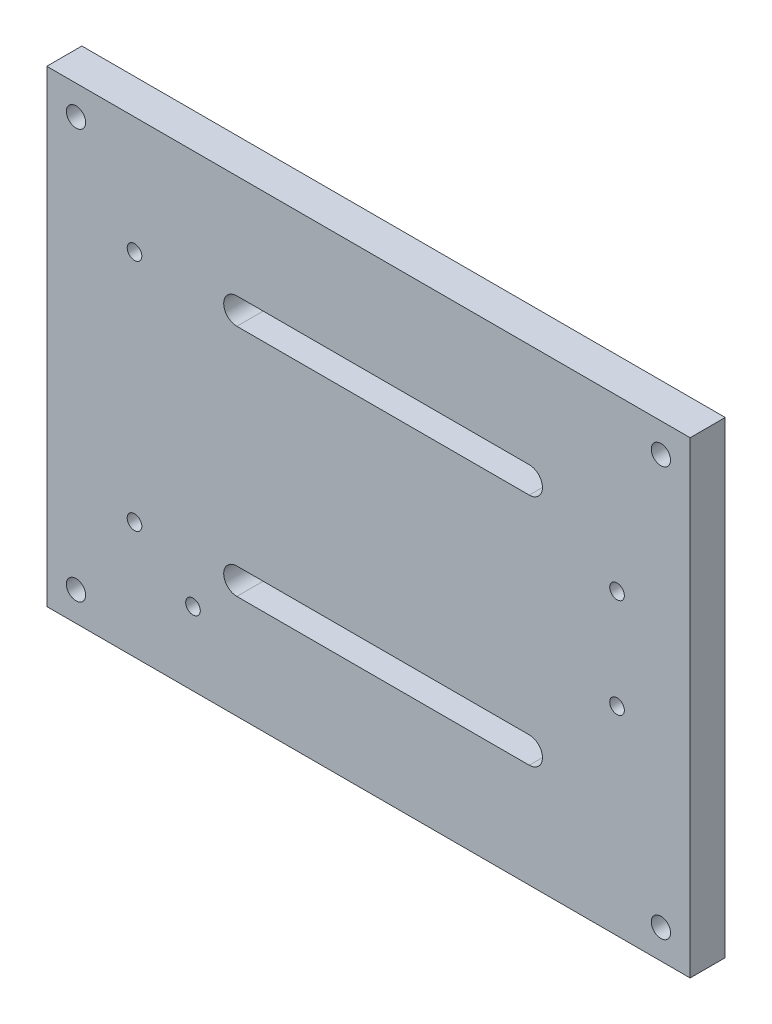
ISO-10303-21;
HEADER;
FILE_DESCRIPTION(('STEP AP214'),'2;1');
FILE_NAME('part.step','',(''),(''),'','','');
FILE_SCHEMA(('AUTOMOTIVE_DESIGN { 1 0 10303 214 1 1 1 1 }'));
ENDSEC;
DATA;
#1=APPLICATION_CONTEXT('core data for automotive mechanical design processes');
#2=APPLICATION_PROTOCOL_DEFINITION('international standard','automotive_design',2000,#1);
#3=PRODUCT_CONTEXT('',#1,'mechanical');
#4=PRODUCT('Part','Part','',(#3));
#5=PRODUCT_RELATED_PRODUCT_CATEGORY('part','',(#4));
#6=PRODUCT_DEFINITION_FORMATION('','',#4);
#7=PRODUCT_DEFINITION_CONTEXT('part definition',#1,'design');
#8=PRODUCT_DEFINITION('design','',#6,#7);
#9=PRODUCT_DEFINITION_SHAPE('','',#8);
#10=(LENGTH_UNIT() NAMED_UNIT(*) SI_UNIT(.MILLI.,.METRE.));
#11=(NAMED_UNIT(*) PLANE_ANGLE_UNIT() SI_UNIT($,.RADIAN.));
#12=(NAMED_UNIT(*) SI_UNIT($,.STERADIAN.) SOLID_ANGLE_UNIT());
#13=UNCERTAINTY_MEASURE_WITH_UNIT(LENGTH_MEASURE(1.E-05),#10,'distance_accuracy_value','');
#14=(GEOMETRIC_REPRESENTATION_CONTEXT(3) GLOBAL_UNCERTAINTY_ASSIGNED_CONTEXT((#13)) GLOBAL_UNIT_ASSIGNED_CONTEXT((#10,
#11,#12)) REPRESENTATION_CONTEXT('',''));
#15=CARTESIAN_POINT('',(0.,0.,0.));
#16=DIRECTION('',(0.,0.,1.));
#17=DIRECTION('',(1.,0.,0.));
#18=AXIS2_PLACEMENT_3D('',#15,#16,#17);
#19=CARTESIAN_POINT('',(0.,0.,12.));
#20=DIRECTION('',(0.,0.,-1.));
#21=DIRECTION('',(-1.,0.,0.));
#22=AXIS2_PLACEMENT_3D('',#19,#20,#21);
#23=PLANE('',#22);
#24=CARTESIAN_POINT('',(30.,120.,12.));
#25=DIRECTION('',(0.,0.,1.));
#26=DIRECTION('',(1.,0.,0.));
#27=AXIS2_PLACEMENT_3D('',#24,#25,#26);
#28=CIRCLE('',#27,2.5);
#29=CARTESIAN_POINT('',(32.5,120.,12.));
#30=VERTEX_POINT('',#29);
#31=EDGE_CURVE('E188',#30,#30,#28,.T.);
#32=ORIENTED_EDGE('',*,*,#31,.F.);
#33=EDGE_LOOP('',(#32));
#34=FACE_BOUND('',#33,.T.);
#35=CARTESIAN_POINT('',(65.,40.,12.));
#36=DIRECTION('',(0.,0.,1.));
#37=DIRECTION('',(-1.,0.,0.));
#38=AXIS2_PLACEMENT_3D('',#35,#36,#37);
#39=CIRCLE('',#38,4.5);
#40=CARTESIAN_POINT('',(65.,44.5,12.));
#41=VERTEX_POINT('',#40);
#42=CARTESIAN_POINT('',(65.,35.5,12.));
#43=VERTEX_POINT('',#42);
#44=EDGE_CURVE('E196',#41,#43,#39,.T.);
#45=ORIENTED_EDGE('',*,*,#44,.F.);
#46=DIRECTION('',(-1.,0.,0.));
#47=VECTOR('',#46,1.);
#48=CARTESIAN_POINT('',(65.,44.5,12.));
#49=LINE('',#48,#47);
#50=CARTESIAN_POINT('',(165.,44.5,12.));
#51=VERTEX_POINT('',#50);
#52=EDGE_CURVE('E207',#51,#41,#49,.T.);
#53=ORIENTED_EDGE('',*,*,#52,.F.);
#54=CARTESIAN_POINT('',(165.,40.,12.));
#55=DIRECTION('',(0.,0.,1.));
#56=DIRECTION('',(-1.,0.,0.));
#57=AXIS2_PLACEMENT_3D('',#54,#55,#56);
#58=CIRCLE('',#57,4.5);
#59=CARTESIAN_POINT('',(165.,35.5,12.));
#60=VERTEX_POINT('',#59);
#61=EDGE_CURVE('E203',#60,#51,#58,.T.);
#62=ORIENTED_EDGE('',*,*,#61,.F.);
#63=DIRECTION('',(1.,0.,0.));
#64=VECTOR('',#63,1.);
#65=CARTESIAN_POINT('',(165.,35.5,12.));
#66=LINE('',#65,#64);
#67=EDGE_CURVE('E199',#43,#60,#66,.T.);
#68=ORIENTED_EDGE('',*,*,#67,.F.);
#69=EDGE_LOOP('',(#45,#53,#62,#68));
#70=FACE_BOUND('',#69,.T.);
#71=DIRECTION('',(0.,-1.,0.));
#72=VECTOR('',#71,1.);
#73=CARTESIAN_POINT('',(0.,0.,12.));
#74=LINE('',#73,#72);
#75=CARTESIAN_POINT('',(0.,160.,12.));
#76=VERTEX_POINT('',#75);
#77=CARTESIAN_POINT('',(0.,0.,12.));
#78=VERTEX_POINT('',#77);
#79=EDGE_CURVE('E278',#76,#78,#74,.T.);
#80=ORIENTED_EDGE('',*,*,#79,.T.);
#81=DIRECTION('',(1.,0.,0.));
#82=VECTOR('',#81,1.);
#83=CARTESIAN_POINT('',(0.,0.,12.));
#84=LINE('',#83,#82);
#85=CARTESIAN_POINT('',(220.,0.,12.));
#86=VERTEX_POINT('',#85);
#87=EDGE_CURVE('E282',#78,#86,#84,.T.);
#88=ORIENTED_EDGE('',*,*,#87,.T.);
#89=DIRECTION('',(0.,1.,0.));
#90=VECTOR('',#89,1.);
#91=CARTESIAN_POINT('',(220.,0.,12.));
#92=LINE('',#91,#90);
#93=CARTESIAN_POINT('',(220.,160.,12.));
#94=VERTEX_POINT('',#93);
#95=EDGE_CURVE('E286',#86,#94,#92,.T.);
#96=ORIENTED_EDGE('',*,*,#95,.T.);
#97=DIRECTION('',(-1.,0.,0.));
#98=VECTOR('',#97,1.);
#99=CARTESIAN_POINT('',(0.,160.,12.));
#100=LINE('',#99,#98);
#101=EDGE_CURVE('E289',#94,#76,#100,.T.);
#102=ORIENTED_EDGE('',*,*,#101,.T.);
#103=EDGE_LOOP('',(#80,#88,#96,#102));
#104=FACE_BOUND('',#103,.T.);
#105=CARTESIAN_POINT('',(10.,10.,12.));
#106=DIRECTION('',(0.,0.,1.));
#107=DIRECTION('',(1.,0.,0.));
#108=AXIS2_PLACEMENT_3D('',#105,#106,#107);
#109=CIRCLE('',#108,3.3);
#110=CARTESIAN_POINT('',(13.3,10.,12.));
#111=VERTEX_POINT('',#110);
#112=EDGE_CURVE('E270',#111,#111,#109,.T.);
#113=ORIENTED_EDGE('',*,*,#112,.F.);
#114=EDGE_LOOP('',(#113));
#115=FACE_BOUND('',#114,.T.);
#116=CARTESIAN_POINT('',(10.,150.,12.));
#117=DIRECTION('',(0.,0.,1.));
#118=DIRECTION('',(1.,0.,0.));
#119=AXIS2_PLACEMENT_3D('',#116,#117,#118);
#120=CIRCLE('',#119,3.3);
#121=CARTESIAN_POINT('',(13.3,150.,12.));
#122=VERTEX_POINT('',#121);
#123=EDGE_CURVE('E263',#122,#122,#120,.T.);
#124=ORIENTED_EDGE('',*,*,#123,.F.);
#125=EDGE_LOOP('',(#124));
#126=FACE_BOUND('',#125,.T.);
#127=CARTESIAN_POINT('',(210.,10.,12.));
#128=DIRECTION('',(0.,0.,1.));
#129=DIRECTION('',(1.,0.,0.));
#130=AXIS2_PLACEMENT_3D('',#127,#128,#129);
#131=CIRCLE('',#130,3.3);
#132=CARTESIAN_POINT('',(213.3,10.,12.));
#133=VERTEX_POINT('',#132);
#134=EDGE_CURVE('E255',#133,#133,#131,.T.);
#135=ORIENTED_EDGE('',*,*,#134,.F.);
#136=EDGE_LOOP('',(#135));
#137=FACE_BOUND('',#136,.T.);
#138=CARTESIAN_POINT('',(210.,150.,12.));
#139=DIRECTION('',(0.,0.,1.));
#140=DIRECTION('',(1.,0.,0.));
#141=AXIS2_PLACEMENT_3D('',#138,#139,#140);
#142=CIRCLE('',#141,3.3);
#143=CARTESIAN_POINT('',(213.3,150.,12.));
#144=VERTEX_POINT('',#143);
#145=EDGE_CURVE('E247',#144,#144,#142,.T.);
#146=ORIENTED_EDGE('',*,*,#145,.F.);
#147=EDGE_LOOP('',(#146));
#148=FACE_BOUND('',#147,.T.);
#149=CARTESIAN_POINT('',(30.,40.,12.));
#150=DIRECTION('',(0.,0.,1.));
#151=DIRECTION('',(1.,0.,0.));
#152=AXIS2_PLACEMENT_3D('',#149,#150,#151);
#153=CIRCLE('',#152,2.5);
#154=CARTESIAN_POINT('',(32.5,40.,12.));
#155=VERTEX_POINT('',#154);
#156=EDGE_CURVE('E239',#155,#155,#153,.T.);
#157=ORIENTED_EDGE('',*,*,#156,.F.);
#158=EDGE_LOOP('',(#157));
#159=FACE_BOUND('',#158,.T.);
#160=CARTESIAN_POINT('',(65.,120.,12.));
#161=DIRECTION('',(0.,0.,1.));
#162=DIRECTION('',(-1.,0.,0.));
#163=AXIS2_PLACEMENT_3D('',#160,#161,#162);
#164=CIRCLE('',#163,4.5);
#165=CARTESIAN_POINT('',(65.,124.5,12.));
#166=VERTEX_POINT('',#165);
#167=CARTESIAN_POINT('',(65.,115.5,12.));
#168=VERTEX_POINT('',#167);
#169=EDGE_CURVE('E135',#166,#168,#164,.T.);
#170=ORIENTED_EDGE('',*,*,#169,.F.);
#171=DIRECTION('',(-1.,0.,0.));
#172=VECTOR('',#171,1.);
#173=CARTESIAN_POINT('',(65.,124.5,12.));
#174=LINE('',#173,#172);
#175=CARTESIAN_POINT('',(165.,124.5,12.));
#176=VERTEX_POINT('',#175);
#177=EDGE_CURVE('E164',#176,#166,#174,.T.);
#178=ORIENTED_EDGE('',*,*,#177,.F.);
#179=CARTESIAN_POINT('',(165.,120.,12.));
#180=DIRECTION('',(0.,0.,1.));
#181=DIRECTION('',(-1.,0.,0.));
#182=AXIS2_PLACEMENT_3D('',#179,#180,#181);
#183=CIRCLE('',#182,4.5);
#184=CARTESIAN_POINT('',(165.,115.5,12.));
#185=VERTEX_POINT('',#184);
#186=EDGE_CURVE('E158',#185,#176,#183,.T.);
#187=ORIENTED_EDGE('',*,*,#186,.F.);
#188=DIRECTION('',(1.,0.,0.));
#189=VECTOR('',#188,1.);
#190=CARTESIAN_POINT('',(165.,115.5,12.));
#191=LINE('',#190,#189);
#192=EDGE_CURVE('E144',#168,#185,#191,.T.);
#193=ORIENTED_EDGE('',*,*,#192,.F.);
#194=EDGE_LOOP('',(#170,#178,#187,#193));
#195=FACE_BOUND('',#194,.T.);
#196=CARTESIAN_POINT('',(50.,25.,12.));
#197=DIRECTION('',(0.,0.,1.));
#198=DIRECTION('',(1.,0.,0.));
#199=AXIS2_PLACEMENT_3D('',#196,#197,#198);
#200=CIRCLE('',#199,2.5);
#201=CARTESIAN_POINT('',(52.5,25.,12.));
#202=VERTEX_POINT('',#201);
#203=EDGE_CURVE('E172',#202,#202,#200,.T.);
#204=ORIENTED_EDGE('',*,*,#203,.F.);
#205=EDGE_LOOP('',(#204));
#206=FACE_BOUND('',#205,.T.);
#207=CARTESIAN_POINT('',(195.,68.,12.));
#208=DIRECTION('',(0.,0.,1.));
#209=DIRECTION('',(1.,0.,0.));
#210=AXIS2_PLACEMENT_3D('',#207,#208,#209);
#211=CIRCLE('',#210,2.5);
#212=CARTESIAN_POINT('',(197.5,68.,12.));
#213=VERTEX_POINT('',#212);
#214=EDGE_CURVE('E386',#213,#213,#211,.T.);
#215=ORIENTED_EDGE('',*,*,#214,.F.);
#216=EDGE_LOOP('',(#215));
#217=FACE_BOUND('',#216,.T.);
#218=CARTESIAN_POINT('',(195.,102.,12.));
#219=DIRECTION('',(0.,0.,1.));
#220=DIRECTION('',(1.,0.,0.));
#221=AXIS2_PLACEMENT_3D('',#218,#219,#220);
#222=CIRCLE('',#221,2.5);
#223=CARTESIAN_POINT('',(197.5,102.,12.));
#224=VERTEX_POINT('',#223);
#225=EDGE_CURVE('E379',#224,#224,#222,.T.);
#226=ORIENTED_EDGE('',*,*,#225,.F.);
#227=EDGE_LOOP('',(#226));
#228=FACE_BOUND('',#227,.T.);
#229=ADVANCED_FACE('F45',(#34,#70,#104,#115,#126,#137,#148,#159,#195,#206,#217,#228),#23,.F.);
#230=CARTESIAN_POINT('',(0.,0.,0.));
#231=DIRECTION('',(0.,0.,-1.));
#232=DIRECTION('',(-1.,0.,0.));
#233=AXIS2_PLACEMENT_3D('',#230,#231,#232);
#234=PLANE('',#233);
#235=CARTESIAN_POINT('',(195.,68.,0.));
#236=DIRECTION('',(0.,0.,1.));
#237=DIRECTION('',(1.,0.,0.));
#238=AXIS2_PLACEMENT_3D('',#235,#236,#237);
#239=CIRCLE('',#238,2.5);
#240=CARTESIAN_POINT('',(197.5,68.,0.));
#241=VERTEX_POINT('',#240);
#242=EDGE_CURVE('E383',#241,#241,#239,.T.);
#243=ORIENTED_EDGE('',*,*,#242,.T.);
#244=EDGE_LOOP('',(#243));
#245=FACE_BOUND('',#244,.T.);
#246=DIRECTION('',(-1.,0.,0.));
#247=VECTOR('',#246,1.);
#248=CARTESIAN_POINT('',(65.,124.5,0.));
#249=LINE('',#248,#247);
#250=CARTESIAN_POINT('',(165.,124.5,0.));
#251=VERTEX_POINT('',#250);
#252=CARTESIAN_POINT('',(65.,124.5,0.));
#253=VERTEX_POINT('',#252);
#254=EDGE_CURVE('E145',#251,#253,#249,.T.);
#255=ORIENTED_EDGE('',*,*,#254,.T.);
#256=CARTESIAN_POINT('',(65.,120.,0.));
#257=DIRECTION('',(0.,0.,1.));
#258=DIRECTION('',(-1.,0.,0.));
#259=AXIS2_PLACEMENT_3D('',#256,#257,#258);
#260=CIRCLE('',#259,4.5);
#261=CARTESIAN_POINT('',(65.,115.5,0.));
#262=VERTEX_POINT('',#261);
#263=EDGE_CURVE('E69',#253,#262,#260,.T.);
#264=ORIENTED_EDGE('',*,*,#263,.T.);
#265=DIRECTION('',(1.,0.,0.));
#266=VECTOR('',#265,1.);
#267=CARTESIAN_POINT('',(165.,115.5,0.));
#268=LINE('',#267,#266);
#269=CARTESIAN_POINT('',(165.,115.5,0.));
#270=VERTEX_POINT('',#269);
#271=EDGE_CURVE('E151',#262,#270,#268,.T.);
#272=ORIENTED_EDGE('',*,*,#271,.T.);
#273=CARTESIAN_POINT('',(165.,120.,0.));
#274=DIRECTION('',(0.,0.,1.));
#275=DIRECTION('',(-1.,0.,0.));
#276=AXIS2_PLACEMENT_3D('',#273,#274,#275);
#277=CIRCLE('',#276,4.5);
#278=EDGE_CURVE('E175',#270,#251,#277,.T.);
#279=ORIENTED_EDGE('',*,*,#278,.T.);
#280=EDGE_LOOP('',(#255,#264,#272,#279));
#281=FACE_BOUND('',#280,.T.);
#282=CARTESIAN_POINT('',(30.,120.,0.));
#283=DIRECTION('',(0.,0.,1.));
#284=DIRECTION('',(1.,0.,0.));
#285=AXIS2_PLACEMENT_3D('',#282,#283,#284);
#286=CIRCLE('',#285,2.5);
#287=CARTESIAN_POINT('',(32.5,120.,0.));
#288=VERTEX_POINT('',#287);
#289=EDGE_CURVE('E153',#288,#288,#286,.T.);
#290=ORIENTED_EDGE('',*,*,#289,.T.);
#291=EDGE_LOOP('',(#290));
#292=FACE_BOUND('',#291,.T.);
#293=CARTESIAN_POINT('',(210.,150.,0.));
#294=DIRECTION('',(0.,0.,1.));
#295=DIRECTION('',(1.,0.,0.));
#296=AXIS2_PLACEMENT_3D('',#293,#294,#295);
#297=CIRCLE('',#296,3.3);
#298=CARTESIAN_POINT('',(213.3,150.,0.));
#299=VERTEX_POINT('',#298);
#300=EDGE_CURVE('E243',#299,#299,#297,.T.);
#301=ORIENTED_EDGE('',*,*,#300,.T.);
#302=EDGE_LOOP('',(#301));
#303=FACE_BOUND('',#302,.T.);
#304=CARTESIAN_POINT('',(10.,150.,0.));
#305=DIRECTION('',(0.,0.,1.));
#306=DIRECTION('',(1.,0.,0.));
#307=AXIS2_PLACEMENT_3D('',#304,#305,#306);
#308=CIRCLE('',#307,3.3);
#309=CARTESIAN_POINT('',(13.3,150.,0.));
#310=VERTEX_POINT('',#309);
#311=EDGE_CURVE('E259',#310,#310,#308,.T.);
#312=ORIENTED_EDGE('',*,*,#311,.T.);
#313=EDGE_LOOP('',(#312));
#314=FACE_BOUND('',#313,.T.);
#315=DIRECTION('',(0.,-1.,0.));
#316=VECTOR('',#315,1.);
#317=CARTESIAN_POINT('',(0.,0.,0.));
#318=LINE('',#317,#316);
#319=CARTESIAN_POINT('',(0.,160.,0.));
#320=VERTEX_POINT('',#319);
#321=CARTESIAN_POINT('',(0.,0.,0.));
#322=VERTEX_POINT('',#321);
#323=EDGE_CURVE('E274',#320,#322,#318,.T.);
#324=ORIENTED_EDGE('',*,*,#323,.F.);
#325=DIRECTION('',(-1.,0.,0.));
#326=VECTOR('',#325,1.);
#327=CARTESIAN_POINT('',(0.,160.,0.));
#328=LINE('',#327,#326);
#329=CARTESIAN_POINT('',(220.,160.,0.));
#330=VERTEX_POINT('',#329);
#331=EDGE_CURVE('E283',#330,#320,#328,.T.);
#332=ORIENTED_EDGE('',*,*,#331,.F.);
#333=DIRECTION('',(0.,1.,0.));
#334=VECTOR('',#333,1.);
#335=CARTESIAN_POINT('',(220.,0.,0.));
#336=LINE('',#335,#334);
#337=CARTESIAN_POINT('',(220.,0.,0.));
#338=VERTEX_POINT('',#337);
#339=EDGE_CURVE('E299',#338,#330,#336,.T.);
#340=ORIENTED_EDGE('',*,*,#339,.F.);
#341=DIRECTION('',(1.,0.,0.));
#342=VECTOR('',#341,1.);
#343=CARTESIAN_POINT('',(0.,0.,0.));
#344=LINE('',#343,#342);
#345=EDGE_CURVE('E296',#322,#338,#344,.T.);
#346=ORIENTED_EDGE('',*,*,#345,.F.);
#347=EDGE_LOOP('',(#324,#332,#340,#346));
#348=FACE_BOUND('',#347,.T.);
#349=CARTESIAN_POINT('',(10.,10.,0.));
#350=DIRECTION('',(0.,0.,1.));
#351=DIRECTION('',(1.,0.,0.));
#352=AXIS2_PLACEMENT_3D('',#349,#350,#351);
#353=CIRCLE('',#352,3.3);
#354=CARTESIAN_POINT('',(13.3,10.,0.));
#355=VERTEX_POINT('',#354);
#356=EDGE_CURVE('E267',#355,#355,#353,.T.);
#357=ORIENTED_EDGE('',*,*,#356,.T.);
#358=EDGE_LOOP('',(#357));
#359=FACE_BOUND('',#358,.T.);
#360=CARTESIAN_POINT('',(210.,10.,0.));
#361=DIRECTION('',(0.,0.,1.));
#362=DIRECTION('',(1.,0.,0.));
#363=AXIS2_PLACEMENT_3D('',#360,#361,#362);
#364=CIRCLE('',#363,3.3);
#365=CARTESIAN_POINT('',(213.3,10.,0.));
#366=VERTEX_POINT('',#365);
#367=EDGE_CURVE('E251',#366,#366,#364,.T.);
#368=ORIENTED_EDGE('',*,*,#367,.T.);
#369=EDGE_LOOP('',(#368));
#370=FACE_BOUND('',#369,.T.);
#371=CARTESIAN_POINT('',(30.,40.,0.));
#372=DIRECTION('',(0.,0.,1.));
#373=DIRECTION('',(1.,0.,0.));
#374=AXIS2_PLACEMENT_3D('',#371,#372,#373);
#375=CIRCLE('',#374,2.5);
#376=CARTESIAN_POINT('',(32.5,40.,0.));
#377=VERTEX_POINT('',#376);
#378=EDGE_CURVE('E238',#377,#377,#375,.T.);
#379=ORIENTED_EDGE('',*,*,#378,.T.);
#380=EDGE_LOOP('',(#379));
#381=FACE_BOUND('',#380,.T.);
#382=DIRECTION('',(-1.,0.,0.));
#383=VECTOR('',#382,1.);
#384=CARTESIAN_POINT('',(65.,44.5,0.));
#385=LINE('',#384,#383);
#386=CARTESIAN_POINT('',(165.,44.5,0.));
#387=VERTEX_POINT('',#386);
#388=CARTESIAN_POINT('',(65.,44.5,0.));
#389=VERTEX_POINT('',#388);
#390=EDGE_CURVE('E200',#387,#389,#385,.T.);
#391=ORIENTED_EDGE('',*,*,#390,.T.);
#392=CARTESIAN_POINT('',(65.,40.,0.));
#393=DIRECTION('',(0.,0.,1.));
#394=DIRECTION('',(-1.,0.,0.));
#395=AXIS2_PLACEMENT_3D('',#392,#393,#394);
#396=CIRCLE('',#395,4.5);
#397=CARTESIAN_POINT('',(65.,35.5,0.));
#398=VERTEX_POINT('',#397);
#399=EDGE_CURVE('E192',#389,#398,#396,.T.);
#400=ORIENTED_EDGE('',*,*,#399,.T.);
#401=DIRECTION('',(1.,0.,0.));
#402=VECTOR('',#401,1.);
#403=CARTESIAN_POINT('',(165.,35.5,0.));
#404=LINE('',#403,#402);
#405=CARTESIAN_POINT('',(165.,35.5,0.));
#406=VERTEX_POINT('',#405);
#407=EDGE_CURVE('E214',#398,#406,#404,.T.);
#408=ORIENTED_EDGE('',*,*,#407,.T.);
#409=CARTESIAN_POINT('',(165.,40.,0.));
#410=DIRECTION('',(0.,0.,1.));
#411=DIRECTION('',(-1.,0.,0.));
#412=AXIS2_PLACEMENT_3D('',#409,#410,#411);
#413=CIRCLE('',#412,4.5);
#414=EDGE_CURVE('E218',#406,#387,#413,.T.);
#415=ORIENTED_EDGE('',*,*,#414,.T.);
#416=EDGE_LOOP('',(#391,#400,#408,#415));
#417=FACE_BOUND('',#416,.T.);
#418=CARTESIAN_POINT('',(50.,25.,0.));
#419=DIRECTION('',(0.,0.,1.));
#420=DIRECTION('',(1.,0.,0.));
#421=AXIS2_PLACEMENT_3D('',#418,#419,#420);
#422=CIRCLE('',#421,2.5);
#423=CARTESIAN_POINT('',(52.5,25.,0.));
#424=VERTEX_POINT('',#423);
#425=EDGE_CURVE('E373',#424,#424,#422,.T.);
#426=ORIENTED_EDGE('',*,*,#425,.T.);
#427=EDGE_LOOP('',(#426));
#428=FACE_BOUND('',#427,.T.);
#429=CARTESIAN_POINT('',(195.,102.,0.));
#430=DIRECTION('',(0.,0.,1.));
#431=DIRECTION('',(1.,0.,0.));
#432=AXIS2_PLACEMENT_3D('',#429,#430,#431);
#433=CIRCLE('',#432,2.5);
#434=CARTESIAN_POINT('',(197.5,102.,0.));
#435=VERTEX_POINT('',#434);
#436=EDGE_CURVE('E376',#435,#435,#433,.T.);
#437=ORIENTED_EDGE('',*,*,#436,.T.);
#438=EDGE_LOOP('',(#437));
#439=FACE_BOUND('',#438,.T.);
#440=ADVANCED_FACE('F321',(#245,#281,#292,#303,#314,#348,#359,#370,#381,#417,#428,#439),#234,.T.);
#441=CARTESIAN_POINT('',(0.,0.,12.));
#442=DIRECTION('',(1.,0.,0.));
#443=DIRECTION('',(0.,0.,-1.));
#444=AXIS2_PLACEMENT_3D('',#441,#442,#443);
#445=PLANE('',#444);
#446=ORIENTED_EDGE('',*,*,#323,.T.);
#447=DIRECTION('',(0.,0.,-1.));
#448=VECTOR('',#447,1.);
#449=CARTESIAN_POINT('',(0.,0.,12.));
#450=LINE('',#449,#448);
#451=EDGE_CURVE('E11',#78,#322,#450,.T.);
#452=ORIENTED_EDGE('',*,*,#451,.F.);
#453=ORIENTED_EDGE('',*,*,#79,.F.);
#454=DIRECTION('',(0.,0.,-1.));
#455=VECTOR('',#454,1.);
#456=CARTESIAN_POINT('',(0.,160.,12.));
#457=LINE('',#456,#455);
#458=EDGE_CURVE('E292',#76,#320,#457,.T.);
#459=ORIENTED_EDGE('',*,*,#458,.T.);
#460=EDGE_LOOP('',(#446,#452,#453,#459));
#461=FACE_BOUND('',#460,.T.);
#462=ADVANCED_FACE('F47',(#461),#445,.F.);
#463=CARTESIAN_POINT('',(0.,0.,12.));
#464=DIRECTION('',(0.,1.,0.));
#465=DIRECTION('',(0.,0.,1.));
#466=AXIS2_PLACEMENT_3D('',#463,#464,#465);
#467=PLANE('',#466);
#468=ORIENTED_EDGE('',*,*,#345,.T.);
#469=DIRECTION('',(0.,0.,-1.));
#470=VECTOR('',#469,1.);
#471=CARTESIAN_POINT('',(220.,0.,12.));
#472=LINE('',#471,#470);
#473=EDGE_CURVE('E54',#86,#338,#472,.T.);
#474=ORIENTED_EDGE('',*,*,#473,.F.);
#475=ORIENTED_EDGE('',*,*,#87,.F.);
#476=ORIENTED_EDGE('',*,*,#451,.T.);
#477=EDGE_LOOP('',(#468,#474,#475,#476));
#478=FACE_BOUND('',#477,.T.);
#479=ADVANCED_FACE('F332',(#478),#467,.F.);
#480=CARTESIAN_POINT('',(220.,0.,12.));
#481=DIRECTION('',(-1.,0.,0.));
#482=DIRECTION('',(0.,0.,1.));
#483=AXIS2_PLACEMENT_3D('',#480,#481,#482);
#484=PLANE('',#483);
#485=ORIENTED_EDGE('',*,*,#339,.T.);
#486=DIRECTION('',(0.,0.,-1.));
#487=VECTOR('',#486,1.);
#488=CARTESIAN_POINT('',(220.,160.,12.));
#489=LINE('',#488,#487);
#490=EDGE_CURVE('E306',#94,#330,#489,.T.);
#491=ORIENTED_EDGE('',*,*,#490,.F.);
#492=ORIENTED_EDGE('',*,*,#95,.F.);
#493=ORIENTED_EDGE('',*,*,#473,.T.);
#494=EDGE_LOOP('',(#485,#491,#492,#493));
#495=FACE_BOUND('',#494,.T.);
#496=ADVANCED_FACE('F315',(#495),#484,.F.);
#497=CARTESIAN_POINT('',(0.,160.,12.));
#498=DIRECTION('',(0.,-1.,0.));
#499=DIRECTION('',(0.,0.,-1.));
#500=AXIS2_PLACEMENT_3D('',#497,#498,#499);
#501=PLANE('',#500);
#502=ORIENTED_EDGE('',*,*,#331,.T.);
#503=ORIENTED_EDGE('',*,*,#458,.F.);
#504=ORIENTED_EDGE('',*,*,#101,.F.);
#505=ORIENTED_EDGE('',*,*,#490,.T.);
#506=EDGE_LOOP('',(#502,#503,#504,#505));
#507=FACE_BOUND('',#506,.T.);
#508=ADVANCED_FACE('F325',(#507),#501,.F.);
#509=CARTESIAN_POINT('',(10.,10.,12.));
#510=DIRECTION('',(0.,0.,-1.));
#511=DIRECTION('',(-1.,0.,0.));
#512=AXIS2_PLACEMENT_3D('',#509,#510,#511);
#513=CYLINDRICAL_SURFACE('',#512,3.3);
#514=ORIENTED_EDGE('',*,*,#112,.T.);
#515=EDGE_LOOP('',(#514));
#516=FACE_BOUND('',#515,.T.);
#517=ORIENTED_EDGE('',*,*,#356,.F.);
#518=EDGE_LOOP('',(#517));
#519=FACE_BOUND('',#518,.T.);
#520=ADVANCED_FACE('F348',(#516,#519),#513,.F.);
#521=CARTESIAN_POINT('',(10.,150.,12.));
#522=DIRECTION('',(0.,0.,-1.));
#523=DIRECTION('',(-1.,0.,0.));
#524=AXIS2_PLACEMENT_3D('',#521,#522,#523);
#525=CYLINDRICAL_SURFACE('',#524,3.3);
#526=ORIENTED_EDGE('',*,*,#123,.T.);
#527=EDGE_LOOP('',(#526));
#528=FACE_BOUND('',#527,.T.);
#529=ORIENTED_EDGE('',*,*,#311,.F.);
#530=EDGE_LOOP('',(#529));
#531=FACE_BOUND('',#530,.T.);
#532=ADVANCED_FACE('F354',(#528,#531),#525,.F.);
#533=CARTESIAN_POINT('',(210.,10.,12.));
#534=DIRECTION('',(0.,0.,-1.));
#535=DIRECTION('',(-1.,0.,0.));
#536=AXIS2_PLACEMENT_3D('',#533,#534,#535);
#537=CYLINDRICAL_SURFACE('',#536,3.3);
#538=ORIENTED_EDGE('',*,*,#134,.T.);
#539=EDGE_LOOP('',(#538));
#540=FACE_BOUND('',#539,.T.);
#541=ORIENTED_EDGE('',*,*,#367,.F.);
#542=EDGE_LOOP('',(#541));
#543=FACE_BOUND('',#542,.T.);
#544=ADVANCED_FACE('F358',(#540,#543),#537,.F.);
#545=CARTESIAN_POINT('',(210.,150.,12.));
#546=DIRECTION('',(0.,0.,-1.));
#547=DIRECTION('',(-1.,0.,0.));
#548=AXIS2_PLACEMENT_3D('',#545,#546,#547);
#549=CYLINDRICAL_SURFACE('',#548,3.3);
#550=ORIENTED_EDGE('',*,*,#145,.T.);
#551=EDGE_LOOP('',(#550));
#552=FACE_BOUND('',#551,.T.);
#553=ORIENTED_EDGE('',*,*,#300,.F.);
#554=EDGE_LOOP('',(#553));
#555=FACE_BOUND('',#554,.T.);
#556=ADVANCED_FACE('F450',(#552,#555),#549,.F.);
#557=CARTESIAN_POINT('',(30.,40.,12.));
#558=DIRECTION('',(0.,0.,-1.));
#559=DIRECTION('',(-1.,0.,0.));
#560=AXIS2_PLACEMENT_3D('',#557,#558,#559);
#561=CYLINDRICAL_SURFACE('',#560,2.5);
#562=ORIENTED_EDGE('',*,*,#156,.T.);
#563=EDGE_LOOP('',(#562));
#564=FACE_BOUND('',#563,.T.);
#565=ORIENTED_EDGE('',*,*,#378,.F.);
#566=EDGE_LOOP('',(#565));
#567=FACE_BOUND('',#566,.T.);
#568=ADVANCED_FACE('F446',(#564,#567),#561,.F.);
#569=CARTESIAN_POINT('',(65.,40.,12.));
#570=DIRECTION('',(0.,0.,-1.));
#571=DIRECTION('',(-1.,0.,0.));
#572=AXIS2_PLACEMENT_3D('',#569,#570,#571);
#573=CYLINDRICAL_SURFACE('',#572,4.5);
#574=ORIENTED_EDGE('',*,*,#399,.F.);
#575=DIRECTION('',(0.,0.,-1.));
#576=VECTOR('',#575,1.);
#577=CARTESIAN_POINT('',(65.,44.5,12.));
#578=LINE('',#577,#576);
#579=EDGE_CURVE('E210',#41,#389,#578,.T.);
#580=ORIENTED_EDGE('',*,*,#579,.F.);
#581=ORIENTED_EDGE('',*,*,#44,.T.);
#582=DIRECTION('',(0.,0.,-1.));
#583=VECTOR('',#582,1.);
#584=CARTESIAN_POINT('',(65.,35.5,12.));
#585=LINE('',#584,#583);
#586=EDGE_CURVE('E234',#43,#398,#585,.T.);
#587=ORIENTED_EDGE('',*,*,#586,.T.);
#588=EDGE_LOOP('',(#574,#580,#581,#587));
#589=FACE_BOUND('',#588,.T.);
#590=ADVANCED_FACE('F442',(#589),#573,.F.);
#591=CARTESIAN_POINT('',(165.,35.5,12.));
#592=DIRECTION('',(0.,1.,0.));
#593=DIRECTION('',(0.,0.,1.));
#594=AXIS2_PLACEMENT_3D('',#591,#592,#593);
#595=PLANE('',#594);
#596=ORIENTED_EDGE('',*,*,#407,.F.);
#597=ORIENTED_EDGE('',*,*,#586,.F.);
#598=ORIENTED_EDGE('',*,*,#67,.T.);
#599=DIRECTION('',(0.,0.,-1.));
#600=VECTOR('',#599,1.);
#601=CARTESIAN_POINT('',(165.,35.5,12.));
#602=LINE('',#601,#600);
#603=EDGE_CURVE('E231',#60,#406,#602,.T.);
#604=ORIENTED_EDGE('',*,*,#603,.T.);
#605=EDGE_LOOP('',(#596,#597,#598,#604));
#606=FACE_BOUND('',#605,.T.);
#607=ADVANCED_FACE('F438',(#606),#595,.T.);
#608=CARTESIAN_POINT('',(165.,40.,12.));
#609=DIRECTION('',(0.,0.,-1.));
#610=DIRECTION('',(-1.,0.,0.));
#611=AXIS2_PLACEMENT_3D('',#608,#609,#610);
#612=CYLINDRICAL_SURFACE('',#611,4.5);
#613=ORIENTED_EDGE('',*,*,#414,.F.);
#614=ORIENTED_EDGE('',*,*,#603,.F.);
#615=ORIENTED_EDGE('',*,*,#61,.T.);
#616=DIRECTION('',(0.,0.,-1.));
#617=VECTOR('',#616,1.);
#618=CARTESIAN_POINT('',(165.,44.5,12.));
#619=LINE('',#618,#617);
#620=EDGE_CURVE('E228',#51,#387,#619,.T.);
#621=ORIENTED_EDGE('',*,*,#620,.T.);
#622=EDGE_LOOP('',(#613,#614,#615,#621));
#623=FACE_BOUND('',#622,.T.);
#624=ADVANCED_FACE('F434',(#623),#612,.F.);
#625=CARTESIAN_POINT('',(65.,44.5,12.));
#626=DIRECTION('',(0.,-1.,0.));
#627=DIRECTION('',(0.,0.,-1.));
#628=AXIS2_PLACEMENT_3D('',#625,#626,#627);
#629=PLANE('',#628);
#630=ORIENTED_EDGE('',*,*,#390,.F.);
#631=ORIENTED_EDGE('',*,*,#620,.F.);
#632=ORIENTED_EDGE('',*,*,#52,.T.);
#633=ORIENTED_EDGE('',*,*,#579,.T.);
#634=EDGE_LOOP('',(#630,#631,#632,#633));
#635=FACE_BOUND('',#634,.T.);
#636=ADVANCED_FACE('F430',(#635),#629,.T.);
#637=CARTESIAN_POINT('',(30.,120.,12.));
#638=DIRECTION('',(0.,0.,-1.));
#639=DIRECTION('',(-1.,0.,0.));
#640=AXIS2_PLACEMENT_3D('',#637,#638,#639);
#641=CYLINDRICAL_SURFACE('',#640,2.5);
#642=ORIENTED_EDGE('',*,*,#31,.T.);
#643=EDGE_LOOP('',(#642));
#644=FACE_BOUND('',#643,.T.);
#645=ORIENTED_EDGE('',*,*,#289,.F.);
#646=EDGE_LOOP('',(#645));
#647=FACE_BOUND('',#646,.T.);
#648=ADVANCED_FACE('F427',(#644,#647),#641,.F.);
#649=CARTESIAN_POINT('',(65.,120.,12.));
#650=DIRECTION('',(0.,0.,-1.));
#651=DIRECTION('',(-1.,0.,0.));
#652=AXIS2_PLACEMENT_3D('',#649,#650,#651);
#653=CYLINDRICAL_SURFACE('',#652,4.5);
#654=ORIENTED_EDGE('',*,*,#263,.F.);
#655=DIRECTION('',(0.,0.,-1.));
#656=VECTOR('',#655,1.);
#657=CARTESIAN_POINT('',(65.,124.5,12.));
#658=LINE('',#657,#656);
#659=EDGE_CURVE('E139',#166,#253,#658,.T.);
#660=ORIENTED_EDGE('',*,*,#659,.F.);
#661=ORIENTED_EDGE('',*,*,#169,.T.);
#662=DIRECTION('',(0.,0.,-1.));
#663=VECTOR('',#662,1.);
#664=CARTESIAN_POINT('',(65.,115.5,12.));
#665=LINE('',#664,#663);
#666=EDGE_CURVE('E138',#168,#262,#665,.T.);
#667=ORIENTED_EDGE('',*,*,#666,.T.);
#668=EDGE_LOOP('',(#654,#660,#661,#667));
#669=FACE_BOUND('',#668,.T.);
#670=ADVANCED_FACE('F137',(#669),#653,.F.);
#671=CARTESIAN_POINT('',(165.,115.5,12.));
#672=DIRECTION('',(0.,1.,0.));
#673=DIRECTION('',(0.,0.,1.));
#674=AXIS2_PLACEMENT_3D('',#671,#672,#673);
#675=PLANE('',#674);
#676=ORIENTED_EDGE('',*,*,#271,.F.);
#677=ORIENTED_EDGE('',*,*,#666,.F.);
#678=ORIENTED_EDGE('',*,*,#192,.T.);
#679=DIRECTION('',(0.,0.,-1.));
#680=VECTOR('',#679,1.);
#681=CARTESIAN_POINT('',(165.,115.5,12.));
#682=LINE('',#681,#680);
#683=EDGE_CURVE('E154',#185,#270,#682,.T.);
#684=ORIENTED_EDGE('',*,*,#683,.T.);
#685=EDGE_LOOP('',(#676,#677,#678,#684));
#686=FACE_BOUND('',#685,.T.);
#687=ADVANCED_FACE('F148',(#686),#675,.T.);
#688=CARTESIAN_POINT('',(165.,120.,12.));
#689=DIRECTION('',(0.,0.,-1.));
#690=DIRECTION('',(-1.,0.,0.));
#691=AXIS2_PLACEMENT_3D('',#688,#689,#690);
#692=CYLINDRICAL_SURFACE('',#691,4.5);
#693=ORIENTED_EDGE('',*,*,#278,.F.);
#694=ORIENTED_EDGE('',*,*,#683,.F.);
#695=ORIENTED_EDGE('',*,*,#186,.T.);
#696=DIRECTION('',(0.,0.,-1.));
#697=VECTOR('',#696,1.);
#698=CARTESIAN_POINT('',(165.,124.5,12.));
#699=LINE('',#698,#697);
#700=EDGE_CURVE('E61',#176,#251,#699,.T.);
#701=ORIENTED_EDGE('',*,*,#700,.T.);
#702=EDGE_LOOP('',(#693,#694,#695,#701));
#703=FACE_BOUND('',#702,.T.);
#704=ADVANCED_FACE('F419',(#703),#692,.F.);
#705=CARTESIAN_POINT('',(65.,124.5,12.));
#706=DIRECTION('',(0.,-1.,0.));
#707=DIRECTION('',(0.,0.,-1.));
#708=AXIS2_PLACEMENT_3D('',#705,#706,#707);
#709=PLANE('',#708);
#710=ORIENTED_EDGE('',*,*,#254,.F.);
#711=ORIENTED_EDGE('',*,*,#700,.F.);
#712=ORIENTED_EDGE('',*,*,#177,.T.);
#713=ORIENTED_EDGE('',*,*,#659,.T.);
#714=EDGE_LOOP('',(#710,#711,#712,#713));
#715=FACE_BOUND('',#714,.T.);
#716=ADVANCED_FACE('F416',(#715),#709,.T.);
#717=CARTESIAN_POINT('',(50.,25.,12.));
#718=DIRECTION('',(0.,0.,-1.));
#719=DIRECTION('',(-1.,0.,0.));
#720=AXIS2_PLACEMENT_3D('',#717,#718,#719);
#721=CYLINDRICAL_SURFACE('',#720,2.5);
#722=ORIENTED_EDGE('',*,*,#203,.T.);
#723=EDGE_LOOP('',(#722));
#724=FACE_BOUND('',#723,.T.);
#725=ORIENTED_EDGE('',*,*,#425,.F.);
#726=EDGE_LOOP('',(#725));
#727=FACE_BOUND('',#726,.T.);
#728=ADVANCED_FACE('F398',(#724,#727),#721,.F.);
#729=CARTESIAN_POINT('',(195.,68.,12.));
#730=DIRECTION('',(0.,0.,-1.));
#731=DIRECTION('',(-1.,0.,0.));
#732=AXIS2_PLACEMENT_3D('',#729,#730,#731);
#733=CYLINDRICAL_SURFACE('',#732,2.5);
#734=ORIENTED_EDGE('',*,*,#214,.T.);
#735=EDGE_LOOP('',(#734));
#736=FACE_BOUND('',#735,.T.);
#737=ORIENTED_EDGE('',*,*,#242,.F.);
#738=EDGE_LOOP('',(#737));
#739=FACE_BOUND('',#738,.T.);
#740=ADVANCED_FACE('F407',(#736,#739),#733,.F.);
#741=CARTESIAN_POINT('',(195.,102.,12.));
#742=DIRECTION('',(0.,0.,-1.));
#743=DIRECTION('',(-1.,0.,0.));
#744=AXIS2_PLACEMENT_3D('',#741,#742,#743);
#745=CYLINDRICAL_SURFACE('',#744,2.5);
#746=ORIENTED_EDGE('',*,*,#225,.T.);
#747=EDGE_LOOP('',(#746));
#748=FACE_BOUND('',#747,.T.);
#749=ORIENTED_EDGE('',*,*,#436,.F.);
#750=EDGE_LOOP('',(#749));
#751=FACE_BOUND('',#750,.T.);
#752=ADVANCED_FACE('F405',(#748,#751),#745,.F.);
#753=CLOSED_SHELL('',(#229,#440,#462,#479,#496,#508,#520,#532,#544,#556,#568,#590,#607,#624,
#636,#648,#670,#687,#704,#716,#728,#740,#752));
#754=MANIFOLD_SOLID_BREP('B2',#753);
#755=ADVANCED_BREP_SHAPE_REPRESENTATION('',(#18,#754),#14);
#756=SHAPE_DEFINITION_REPRESENTATION(#9,#755);
ENDSEC;
END-ISO-10303-21;
